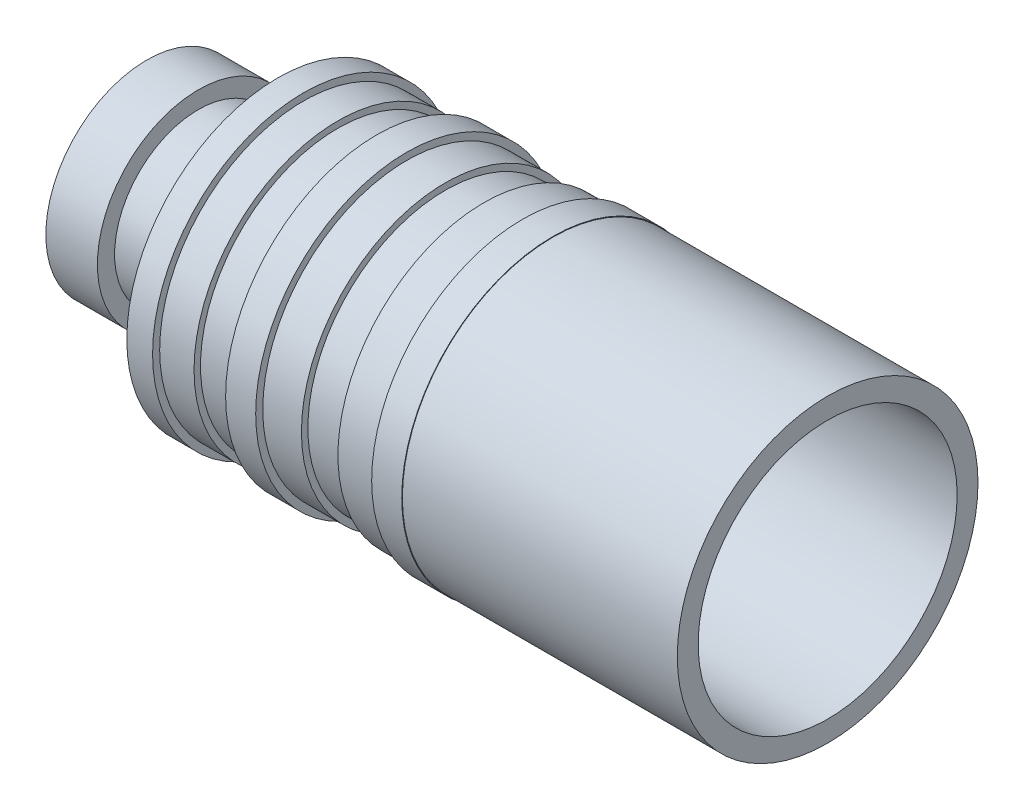
ISO-10303-21;
HEADER;
FILE_DESCRIPTION(('STEP AP214'),'2;1');
FILE_NAME('part.step','',(''),(''),'','','');
FILE_SCHEMA(('AUTOMOTIVE_DESIGN { 1 0 10303 214 1 1 1 1 }'));
ENDSEC;
DATA;
#1=APPLICATION_CONTEXT('core data for automotive mechanical design processes');
#2=APPLICATION_PROTOCOL_DEFINITION('international standard','automotive_design',2000,#1);
#3=PRODUCT_CONTEXT('',#1,'mechanical');
#4=PRODUCT('Part','Part','',(#3));
#5=PRODUCT_RELATED_PRODUCT_CATEGORY('part','',(#4));
#6=PRODUCT_DEFINITION_FORMATION('','',#4);
#7=PRODUCT_DEFINITION_CONTEXT('part definition',#1,'design');
#8=PRODUCT_DEFINITION('design','',#6,#7);
#9=PRODUCT_DEFINITION_SHAPE('','',#8);
#10=(LENGTH_UNIT() NAMED_UNIT(*) SI_UNIT(.MILLI.,.METRE.));
#11=(NAMED_UNIT(*) PLANE_ANGLE_UNIT() SI_UNIT($,.RADIAN.));
#12=(NAMED_UNIT(*) SI_UNIT($,.STERADIAN.) SOLID_ANGLE_UNIT());
#13=UNCERTAINTY_MEASURE_WITH_UNIT(LENGTH_MEASURE(1.E-05),#10,'distance_accuracy_value','');
#14=(GEOMETRIC_REPRESENTATION_CONTEXT(3) GLOBAL_UNCERTAINTY_ASSIGNED_CONTEXT((#13)) GLOBAL_UNIT_ASSIGNED_CONTEXT((#10,
#11,#12)) REPRESENTATION_CONTEXT('',''));
#15=CARTESIAN_POINT('',(0.,0.,0.));
#16=DIRECTION('',(0.,0.,1.));
#17=DIRECTION('',(1.,0.,0.));
#18=AXIS2_PLACEMENT_3D('',#15,#16,#17);
#19=CARTESIAN_POINT('',(5.5,0.,0.));
#20=DIRECTION('',(-1.,0.,0.));
#21=DIRECTION('',(0.,0.,1.));
#22=AXIS2_PLACEMENT_3D('',#19,#20,#21);
#23=CYLINDRICAL_SURFACE('',#22,15.);
#24=CARTESIAN_POINT('',(5.5,0.,0.));
#25=DIRECTION('',(1.,0.,0.));
#26=DIRECTION('',(0.,0.,-1.));
#27=AXIS2_PLACEMENT_3D('',#24,#25,#26);
#28=CIRCLE('',#27,15.);
#29=CARTESIAN_POINT('',(5.5,0.,-15.));
#30=VERTEX_POINT('',#29);
#31=EDGE_CURVE('E126',#30,#30,#28,.T.);
#32=ORIENTED_EDGE('',*,*,#31,.F.);
#33=EDGE_LOOP('',(#32));
#34=FACE_BOUND('',#33,.T.);
#35=CARTESIAN_POINT('',(0.,0.,0.));
#36=DIRECTION('',(1.,0.,0.));
#37=DIRECTION('',(0.,0.,-1.));
#38=AXIS2_PLACEMENT_3D('',#35,#36,#37);
#39=CIRCLE('',#38,15.);
#40=CARTESIAN_POINT('',(0.,0.,-15.));
#41=VERTEX_POINT('',#40);
#42=EDGE_CURVE('E37',#41,#41,#39,.T.);
#43=ORIENTED_EDGE('',*,*,#42,.T.);
#44=EDGE_LOOP('',(#43));
#45=FACE_BOUND('',#44,.T.);
#46=ADVANCED_FACE('F34',(#34,#45),#23,.T.);
#47=CARTESIAN_POINT('',(0.,0.,0.));
#48=DIRECTION('',(1.,0.,0.));
#49=DIRECTION('',(0.,0.,-1.));
#50=AXIS2_PLACEMENT_3D('',#47,#48,#49);
#51=PLANE('',#50);
#52=ORIENTED_EDGE('',*,*,#42,.F.);
#53=EDGE_LOOP('',(#52));
#54=FACE_BOUND('',#53,.T.);
#55=ADVANCED_FACE('F138',(#54),#51,.F.);
#56=CARTESIAN_POINT('',(17.5,0.,0.));
#57=DIRECTION('',(-1.,0.,0.));
#58=DIRECTION('',(0.,0.,1.));
#59=AXIS2_PLACEMENT_3D('',#56,#57,#58);
#60=CYLINDRICAL_SURFACE('',#59,23.5);
#61=CARTESIAN_POINT('',(17.5,0.,0.));
#62=DIRECTION('',(1.,0.,0.));
#63=DIRECTION('',(0.,0.,-1.));
#64=AXIS2_PLACEMENT_3D('',#61,#62,#63);
#65=CIRCLE('',#64,23.5);
#66=CARTESIAN_POINT('',(17.5,0.,-23.5));
#67=VERTEX_POINT('',#66);
#68=EDGE_CURVE('E127',#67,#67,#65,.T.);
#69=ORIENTED_EDGE('',*,*,#68,.F.);
#70=EDGE_LOOP('',(#69));
#71=FACE_BOUND('',#70,.T.);
#72=CARTESIAN_POINT('',(5.5,0.,0.));
#73=DIRECTION('',(1.,0.,0.));
#74=DIRECTION('',(0.,0.,-1.));
#75=AXIS2_PLACEMENT_3D('',#72,#73,#74);
#76=CIRCLE('',#75,23.5);
#77=CARTESIAN_POINT('',(5.5,0.,-23.5));
#78=VERTEX_POINT('',#77);
#79=EDGE_CURVE('E123',#78,#78,#76,.T.);
#80=ORIENTED_EDGE('',*,*,#79,.T.);
#81=EDGE_LOOP('',(#80));
#82=FACE_BOUND('',#81,.T.);
#83=ADVANCED_FACE('F140',(#71,#82),#60,.T.);
#84=CARTESIAN_POINT('',(17.5,0.,0.));
#85=DIRECTION('',(1.,0.,0.));
#86=DIRECTION('',(0.,0.,-1.));
#87=AXIS2_PLACEMENT_3D('',#84,#85,#86);
#88=PLANE('',#87);
#89=CARTESIAN_POINT('',(17.5,0.,0.));
#90=DIRECTION('',(1.,0.,0.));
#91=DIRECTION('',(0.,0.,-1.));
#92=AXIS2_PLACEMENT_3D('',#89,#90,#91);
#93=CIRCLE('',#92,19.5);
#94=CARTESIAN_POINT('',(17.5,0.,-19.5));
#95=VERTEX_POINT('',#94);
#96=EDGE_CURVE('E108',#95,#95,#93,.T.);
#97=ORIENTED_EDGE('',*,*,#96,.F.);
#98=EDGE_LOOP('',(#97));
#99=FACE_BOUND('',#98,.T.);
#100=ORIENTED_EDGE('',*,*,#68,.T.);
#101=EDGE_LOOP('',(#100));
#102=FACE_BOUND('',#101,.T.);
#103=ADVANCED_FACE('F145',(#99,#102),#88,.T.);
#104=CARTESIAN_POINT('',(5.5,0.,0.));
#105=DIRECTION('',(1.,0.,0.));
#106=DIRECTION('',(0.,0.,-1.));
#107=AXIS2_PLACEMENT_3D('',#104,#105,#106);
#108=PLANE('',#107);
#109=ORIENTED_EDGE('',*,*,#31,.T.);
#110=EDGE_LOOP('',(#109));
#111=FACE_BOUND('',#110,.T.);
#112=ORIENTED_EDGE('',*,*,#79,.F.);
#113=EDGE_LOOP('',(#112));
#114=FACE_BOUND('',#113,.T.);
#115=ADVANCED_FACE('F150',(#111,#114),#108,.F.);
#116=CARTESIAN_POINT('',(29.3,0.,0.));
#117=DIRECTION('',(-1.,0.,0.));
#118=DIRECTION('',(0.,0.,1.));
#119=AXIS2_PLACEMENT_3D('',#116,#117,#118);
#120=CYLINDRICAL_SURFACE('',#119,19.5);
#121=CARTESIAN_POINT('',(29.3,0.,0.));
#122=DIRECTION('',(1.,0.,0.));
#123=DIRECTION('',(0.,0.,-1.));
#124=AXIS2_PLACEMENT_3D('',#121,#122,#123);
#125=CIRCLE('',#124,19.5);
#126=CARTESIAN_POINT('',(29.3,0.,-19.5));
#127=VERTEX_POINT('',#126);
#128=EDGE_CURVE('E118',#127,#127,#125,.T.);
#129=ORIENTED_EDGE('',*,*,#128,.F.);
#130=EDGE_LOOP('',(#129));
#131=FACE_BOUND('',#130,.T.);
#132=ORIENTED_EDGE('',*,*,#96,.T.);
#133=EDGE_LOOP('',(#132));
#134=FACE_BOUND('',#133,.T.);
#135=ADVANCED_FACE('F153',(#131,#134),#120,.T.);
#136=CARTESIAN_POINT('',(36.,0.,0.));
#137=DIRECTION('',(-1.,0.,0.));
#138=DIRECTION('',(0.,0.,1.));
#139=AXIS2_PLACEMENT_3D('',#136,#137,#138);
#140=CYLINDRICAL_SURFACE('',#139,20.25);
#141=CARTESIAN_POINT('',(36.,0.,0.));
#142=DIRECTION('',(1.,0.,0.));
#143=DIRECTION('',(0.,0.,-1.));
#144=AXIS2_PLACEMENT_3D('',#141,#142,#143);
#145=CIRCLE('',#144,20.25);
#146=CARTESIAN_POINT('',(36.,0.,-20.25));
#147=VERTEX_POINT('',#146);
#148=EDGE_CURVE('E115',#147,#147,#145,.T.);
#149=ORIENTED_EDGE('',*,*,#148,.F.);
#150=EDGE_LOOP('',(#149));
#151=FACE_BOUND('',#150,.T.);
#152=CARTESIAN_POINT('',(29.3,0.,0.));
#153=DIRECTION('',(1.,0.,0.));
#154=DIRECTION('',(0.,0.,-1.));
#155=AXIS2_PLACEMENT_3D('',#152,#153,#154);
#156=CIRCLE('',#155,20.25);
#157=CARTESIAN_POINT('',(29.3,0.,-20.25));
#158=VERTEX_POINT('',#157);
#159=EDGE_CURVE('E112',#158,#158,#156,.T.);
#160=ORIENTED_EDGE('',*,*,#159,.T.);
#161=EDGE_LOOP('',(#160));
#162=FACE_BOUND('',#161,.T.);
#163=ADVANCED_FACE('F159',(#151,#162),#140,.T.);
#164=CARTESIAN_POINT('',(29.3,0.,0.));
#165=DIRECTION('',(1.,0.,0.));
#166=DIRECTION('',(0.,0.,-1.));
#167=AXIS2_PLACEMENT_3D('',#164,#165,#166);
#168=PLANE('',#167);
#169=ORIENTED_EDGE('',*,*,#128,.T.);
#170=EDGE_LOOP('',(#169));
#171=FACE_BOUND('',#170,.T.);
#172=ORIENTED_EDGE('',*,*,#159,.F.);
#173=EDGE_LOOP('',(#172));
#174=FACE_BOUND('',#173,.T.);
#175=ADVANCED_FACE('F163',(#171,#174),#168,.F.);
#176=CARTESIAN_POINT('',(42.,0.,0.));
#177=DIRECTION('',(-1.,0.,0.));
#178=DIRECTION('',(0.,0.,1.));
#179=AXIS2_PLACEMENT_3D('',#176,#177,#178);
#180=CYLINDRICAL_SURFACE('',#179,35.15);
#181=CARTESIAN_POINT('',(42.,0.,0.));
#182=DIRECTION('',(1.,0.,0.));
#183=DIRECTION('',(0.,0.,-1.));
#184=AXIS2_PLACEMENT_3D('',#181,#182,#183);
#185=CIRCLE('',#184,35.15);
#186=CARTESIAN_POINT('',(42.,0.,-35.15));
#187=VERTEX_POINT('',#186);
#188=EDGE_CURVE('E109',#187,#187,#185,.T.);
#189=ORIENTED_EDGE('',*,*,#188,.F.);
#190=EDGE_LOOP('',(#189));
#191=FACE_BOUND('',#190,.T.);
#192=CARTESIAN_POINT('',(36.,0.,0.));
#193=DIRECTION('',(1.,0.,0.));
#194=DIRECTION('',(0.,0.,-1.));
#195=AXIS2_PLACEMENT_3D('',#192,#193,#194);
#196=CIRCLE('',#195,35.15);
#197=CARTESIAN_POINT('',(36.,0.,-35.15));
#198=VERTEX_POINT('',#197);
#199=EDGE_CURVE('E105',#198,#198,#196,.T.);
#200=ORIENTED_EDGE('',*,*,#199,.T.);
#201=EDGE_LOOP('',(#200));
#202=FACE_BOUND('',#201,.T.);
#203=ADVANCED_FACE('F167',(#191,#202),#180,.T.);
#204=CARTESIAN_POINT('',(42.,0.,0.));
#205=DIRECTION('',(1.,0.,0.));
#206=DIRECTION('',(0.,0.,-1.));
#207=AXIS2_PLACEMENT_3D('',#204,#205,#206);
#208=PLANE('',#207);
#209=CARTESIAN_POINT('',(42.,0.,0.));
#210=DIRECTION('',(1.,0.,0.));
#211=DIRECTION('',(0.,0.,-1.));
#212=AXIS2_PLACEMENT_3D('',#209,#210,#211);
#213=CIRCLE('',#212,33.5);
#214=CARTESIAN_POINT('',(42.,0.,-33.5));
#215=VERTEX_POINT('',#214);
#216=EDGE_CURVE('E102',#215,#215,#213,.T.);
#217=ORIENTED_EDGE('',*,*,#216,.F.);
#218=EDGE_LOOP('',(#217));
#219=FACE_BOUND('',#218,.T.);
#220=ORIENTED_EDGE('',*,*,#188,.T.);
#221=EDGE_LOOP('',(#220));
#222=FACE_BOUND('',#221,.T.);
#223=ADVANCED_FACE('F171',(#219,#222),#208,.T.);
#224=CARTESIAN_POINT('',(36.,0.,0.));
#225=DIRECTION('',(1.,0.,0.));
#226=DIRECTION('',(0.,0.,-1.));
#227=AXIS2_PLACEMENT_3D('',#224,#225,#226);
#228=PLANE('',#227);
#229=ORIENTED_EDGE('',*,*,#148,.T.);
#230=EDGE_LOOP('',(#229));
#231=FACE_BOUND('',#230,.T.);
#232=ORIENTED_EDGE('',*,*,#199,.F.);
#233=EDGE_LOOP('',(#232));
#234=FACE_BOUND('',#233,.T.);
#235=ADVANCED_FACE('F173',(#231,#234),#228,.F.);
#236=CARTESIAN_POINT('',(50.,0.,0.));
#237=DIRECTION('',(-1.,0.,0.));
#238=DIRECTION('',(0.,0.,1.));
#239=AXIS2_PLACEMENT_3D('',#236,#237,#238);
#240=CYLINDRICAL_SURFACE('',#239,33.5);
#241=CARTESIAN_POINT('',(50.,0.,0.));
#242=DIRECTION('',(1.,0.,0.));
#243=DIRECTION('',(0.,0.,-1.));
#244=AXIS2_PLACEMENT_3D('',#241,#242,#243);
#245=CIRCLE('',#244,33.5);
#246=CARTESIAN_POINT('',(50.,0.,-33.5));
#247=VERTEX_POINT('',#246);
#248=EDGE_CURVE('E99',#247,#247,#245,.T.);
#249=ORIENTED_EDGE('',*,*,#248,.F.);
#250=EDGE_LOOP('',(#249));
#251=FACE_BOUND('',#250,.T.);
#252=ORIENTED_EDGE('',*,*,#216,.T.);
#253=EDGE_LOOP('',(#252));
#254=FACE_BOUND('',#253,.T.);
#255=ADVANCED_FACE('F176',(#251,#254),#240,.T.);
#256=CARTESIAN_POINT('',(50.,0.,0.));
#257=DIRECTION('',(1.,0.,0.));
#258=DIRECTION('',(0.,0.,-1.));
#259=AXIS2_PLACEMENT_3D('',#256,#257,#258);
#260=PLANE('',#259);
#261=CARTESIAN_POINT('',(50.,0.,0.));
#262=DIRECTION('',(1.,0.,0.));
#263=DIRECTION('',(0.,0.,-1.));
#264=AXIS2_PLACEMENT_3D('',#261,#262,#263);
#265=CIRCLE('',#264,32.);
#266=CARTESIAN_POINT('',(50.,0.,-32.));
#267=VERTEX_POINT('',#266);
#268=EDGE_CURVE('E90',#267,#267,#265,.T.);
#269=ORIENTED_EDGE('',*,*,#268,.F.);
#270=EDGE_LOOP('',(#269));
#271=FACE_BOUND('',#270,.T.);
#272=ORIENTED_EDGE('',*,*,#248,.T.);
#273=EDGE_LOOP('',(#272));
#274=FACE_BOUND('',#273,.T.);
#275=ADVANCED_FACE('F183',(#271,#274),#260,.T.);
#276=CARTESIAN_POINT('',(59.,0.,0.));
#277=DIRECTION('',(-1.,0.,0.));
#278=DIRECTION('',(0.,0.,1.));
#279=AXIS2_PLACEMENT_3D('',#276,#277,#278);
#280=CYLINDRICAL_SURFACE('',#279,32.);
#281=CARTESIAN_POINT('',(59.,0.,0.));
#282=DIRECTION('',(1.,0.,0.));
#283=DIRECTION('',(0.,0.,-1.));
#284=AXIS2_PLACEMENT_3D('',#281,#282,#283);
#285=CIRCLE('',#284,32.);
#286=CARTESIAN_POINT('',(59.,0.,-32.));
#287=VERTEX_POINT('',#286);
#288=EDGE_CURVE('E94',#287,#287,#285,.T.);
#289=ORIENTED_EDGE('',*,*,#288,.F.);
#290=EDGE_LOOP('',(#289));
#291=FACE_BOUND('',#290,.T.);
#292=ORIENTED_EDGE('',*,*,#268,.T.);
#293=EDGE_LOOP('',(#292));
#294=FACE_BOUND('',#293,.T.);
#295=ADVANCED_FACE('F187',(#291,#294),#280,.T.);
#296=CARTESIAN_POINT('',(66.,0.,0.));
#297=DIRECTION('',(-1.,0.,0.));
#298=DIRECTION('',(0.,0.,1.));
#299=AXIS2_PLACEMENT_3D('',#296,#297,#298);
#300=CYLINDRICAL_SURFACE('',#299,35.15);
#301=CARTESIAN_POINT('',(66.,0.,0.));
#302=DIRECTION('',(1.,0.,0.));
#303=DIRECTION('',(0.,0.,-1.));
#304=AXIS2_PLACEMENT_3D('',#301,#302,#303);
#305=CIRCLE('',#304,35.15);
#306=CARTESIAN_POINT('',(66.,0.,-35.15));
#307=VERTEX_POINT('',#306);
#308=EDGE_CURVE('E91',#307,#307,#305,.T.);
#309=ORIENTED_EDGE('',*,*,#308,.F.);
#310=EDGE_LOOP('',(#309));
#311=FACE_BOUND('',#310,.T.);
#312=CARTESIAN_POINT('',(59.,0.,0.));
#313=DIRECTION('',(1.,0.,0.));
#314=DIRECTION('',(0.,0.,-1.));
#315=AXIS2_PLACEMENT_3D('',#312,#313,#314);
#316=CIRCLE('',#315,35.15);
#317=CARTESIAN_POINT('',(59.,0.,-35.15));
#318=VERTEX_POINT('',#317);
#319=EDGE_CURVE('E87',#318,#318,#316,.T.);
#320=ORIENTED_EDGE('',*,*,#319,.T.);
#321=EDGE_LOOP('',(#320));
#322=FACE_BOUND('',#321,.T.);
#323=ADVANCED_FACE('F191',(#311,#322),#300,.T.);
#324=CARTESIAN_POINT('',(66.,0.,0.));
#325=DIRECTION('',(1.,0.,0.));
#326=DIRECTION('',(0.,0.,-1.));
#327=AXIS2_PLACEMENT_3D('',#324,#325,#326);
#328=PLANE('',#327);
#329=CARTESIAN_POINT('',(66.,0.,0.));
#330=DIRECTION('',(1.,0.,0.));
#331=DIRECTION('',(0.,0.,-1.));
#332=AXIS2_PLACEMENT_3D('',#329,#330,#331);
#333=CIRCLE('',#332,33.5);
#334=CARTESIAN_POINT('',(66.,0.,-33.5));
#335=VERTEX_POINT('',#334);
#336=EDGE_CURVE('E84',#335,#335,#333,.T.);
#337=ORIENTED_EDGE('',*,*,#336,.F.);
#338=EDGE_LOOP('',(#337));
#339=FACE_BOUND('',#338,.T.);
#340=ORIENTED_EDGE('',*,*,#308,.T.);
#341=EDGE_LOOP('',(#340));
#342=FACE_BOUND('',#341,.T.);
#343=ADVANCED_FACE('F195',(#339,#342),#328,.T.);
#344=CARTESIAN_POINT('',(59.,0.,0.));
#345=DIRECTION('',(1.,0.,0.));
#346=DIRECTION('',(0.,0.,-1.));
#347=AXIS2_PLACEMENT_3D('',#344,#345,#346);
#348=PLANE('',#347);
#349=ORIENTED_EDGE('',*,*,#288,.T.);
#350=EDGE_LOOP('',(#349));
#351=FACE_BOUND('',#350,.T.);
#352=ORIENTED_EDGE('',*,*,#319,.F.);
#353=EDGE_LOOP('',(#352));
#354=FACE_BOUND('',#353,.T.);
#355=ADVANCED_FACE('F197',(#351,#354),#348,.F.);
#356=CARTESIAN_POINT('',(75.,0.,0.));
#357=DIRECTION('',(-1.,0.,0.));
#358=DIRECTION('',(0.,0.,1.));
#359=AXIS2_PLACEMENT_3D('',#356,#357,#358);
#360=CYLINDRICAL_SURFACE('',#359,33.5);
#361=CARTESIAN_POINT('',(75.,0.,0.));
#362=DIRECTION('',(1.,0.,0.));
#363=DIRECTION('',(0.,0.,-1.));
#364=AXIS2_PLACEMENT_3D('',#361,#362,#363);
#365=CIRCLE('',#364,33.5);
#366=CARTESIAN_POINT('',(75.,0.,-33.5));
#367=VERTEX_POINT('',#366);
#368=EDGE_CURVE('E81',#367,#367,#365,.T.);
#369=ORIENTED_EDGE('',*,*,#368,.F.);
#370=EDGE_LOOP('',(#369));
#371=FACE_BOUND('',#370,.T.);
#372=ORIENTED_EDGE('',*,*,#336,.T.);
#373=EDGE_LOOP('',(#372));
#374=FACE_BOUND('',#373,.T.);
#375=ADVANCED_FACE('F200',(#371,#374),#360,.T.);
#376=CARTESIAN_POINT('',(75.,0.,0.));
#377=DIRECTION('',(1.,0.,0.));
#378=DIRECTION('',(0.,0.,-1.));
#379=AXIS2_PLACEMENT_3D('',#376,#377,#378);
#380=PLANE('',#379);
#381=CARTESIAN_POINT('',(75.,0.,0.));
#382=DIRECTION('',(1.,0.,0.));
#383=DIRECTION('',(0.,0.,-1.));
#384=AXIS2_PLACEMENT_3D('',#381,#382,#383);
#385=CIRCLE('',#384,32.);
#386=CARTESIAN_POINT('',(75.,0.,-32.));
#387=VERTEX_POINT('',#386);
#388=EDGE_CURVE('E41',#387,#387,#385,.T.);
#389=ORIENTED_EDGE('',*,*,#388,.F.);
#390=EDGE_LOOP('',(#389));
#391=FACE_BOUND('',#390,.T.);
#392=ORIENTED_EDGE('',*,*,#368,.T.);
#393=EDGE_LOOP('',(#392));
#394=FACE_BOUND('',#393,.T.);
#395=ADVANCED_FACE('F207',(#391,#394),#380,.T.);
#396=CARTESIAN_POINT('',(84.,0.,0.));
#397=DIRECTION('',(-1.,0.,0.));
#398=DIRECTION('',(0.,0.,1.));
#399=AXIS2_PLACEMENT_3D('',#396,#397,#398);
#400=CYLINDRICAL_SURFACE('',#399,32.);
#401=CARTESIAN_POINT('',(84.,0.,0.));
#402=DIRECTION('',(1.,0.,0.));
#403=DIRECTION('',(0.,0.,-1.));
#404=AXIS2_PLACEMENT_3D('',#401,#402,#403);
#405=CIRCLE('',#404,32.);
#406=CARTESIAN_POINT('',(84.,0.,-32.));
#407=VERTEX_POINT('',#406);
#408=EDGE_CURVE('E76',#407,#407,#405,.T.);
#409=ORIENTED_EDGE('',*,*,#408,.F.);
#410=EDGE_LOOP('',(#409));
#411=FACE_BOUND('',#410,.T.);
#412=ORIENTED_EDGE('',*,*,#388,.T.);
#413=EDGE_LOOP('',(#412));
#414=FACE_BOUND('',#413,.T.);
#415=ADVANCED_FACE('F211',(#411,#414),#400,.T.);
#416=CARTESIAN_POINT('',(93.,0.,0.));
#417=DIRECTION('',(-1.,0.,0.));
#418=DIRECTION('',(0.,0.,1.));
#419=AXIS2_PLACEMENT_3D('',#416,#417,#418);
#420=CYLINDRICAL_SURFACE('',#419,34.);
#421=CARTESIAN_POINT('',(93.,0.,0.));
#422=DIRECTION('',(1.,0.,0.));
#423=DIRECTION('',(0.,0.,-1.));
#424=AXIS2_PLACEMENT_3D('',#421,#422,#423);
#425=CIRCLE('',#424,34.);
#426=CARTESIAN_POINT('',(93.,0.,-34.));
#427=VERTEX_POINT('',#426);
#428=EDGE_CURVE('E73',#427,#427,#425,.T.);
#429=ORIENTED_EDGE('',*,*,#428,.F.);
#430=EDGE_LOOP('',(#429));
#431=FACE_BOUND('',#430,.T.);
#432=CARTESIAN_POINT('',(84.,0.,0.));
#433=DIRECTION('',(1.,0.,0.));
#434=DIRECTION('',(0.,0.,-1.));
#435=AXIS2_PLACEMENT_3D('',#432,#433,#434);
#436=CIRCLE('',#435,34.);
#437=CARTESIAN_POINT('',(84.,0.,-34.));
#438=VERTEX_POINT('',#437);
#439=EDGE_CURVE('E70',#438,#438,#436,.T.);
#440=ORIENTED_EDGE('',*,*,#439,.T.);
#441=EDGE_LOOP('',(#440));
#442=FACE_BOUND('',#441,.T.);
#443=ADVANCED_FACE('F215',(#431,#442),#420,.T.);
#444=CARTESIAN_POINT('',(84.,0.,0.));
#445=DIRECTION('',(1.,0.,0.));
#446=DIRECTION('',(0.,0.,-1.));
#447=AXIS2_PLACEMENT_3D('',#444,#445,#446);
#448=PLANE('',#447);
#449=ORIENTED_EDGE('',*,*,#408,.T.);
#450=EDGE_LOOP('',(#449));
#451=FACE_BOUND('',#450,.T.);
#452=ORIENTED_EDGE('',*,*,#439,.F.);
#453=EDGE_LOOP('',(#452));
#454=FACE_BOUND('',#453,.T.);
#455=ADVANCED_FACE('F219',(#451,#454),#448,.F.);
#456=CARTESIAN_POINT('',(100.,0.,0.));
#457=DIRECTION('',(-1.,0.,0.));
#458=DIRECTION('',(0.,0.,1.));
#459=AXIS2_PLACEMENT_3D('',#456,#457,#458);
#460=CYLINDRICAL_SURFACE('',#459,35.15);
#461=CARTESIAN_POINT('',(100.,0.,0.));
#462=DIRECTION('',(1.,0.,0.));
#463=DIRECTION('',(0.,0.,-1.));
#464=AXIS2_PLACEMENT_3D('',#461,#462,#463);
#465=CIRCLE('',#464,35.15);
#466=CARTESIAN_POINT('',(100.,0.,-35.15));
#467=VERTEX_POINT('',#466);
#468=EDGE_CURVE('E67',#467,#467,#465,.T.);
#469=ORIENTED_EDGE('',*,*,#468,.F.);
#470=EDGE_LOOP('',(#469));
#471=FACE_BOUND('',#470,.T.);
#472=CARTESIAN_POINT('',(93.,0.,0.));
#473=DIRECTION('',(1.,0.,0.));
#474=DIRECTION('',(0.,0.,-1.));
#475=AXIS2_PLACEMENT_3D('',#472,#473,#474);
#476=CIRCLE('',#475,35.15);
#477=CARTESIAN_POINT('',(93.,0.,-35.15));
#478=VERTEX_POINT('',#477);
#479=EDGE_CURVE('E65',#478,#478,#476,.T.);
#480=ORIENTED_EDGE('',*,*,#479,.T.);
#481=EDGE_LOOP('',(#480));
#482=FACE_BOUND('',#481,.T.);
#483=ADVANCED_FACE('F223',(#471,#482),#460,.T.);
#484=CARTESIAN_POINT('',(100.,0.,0.));
#485=DIRECTION('',(1.,0.,0.));
#486=DIRECTION('',(0.,0.,-1.));
#487=AXIS2_PLACEMENT_3D('',#484,#485,#486);
#488=PLANE('',#487);
#489=CARTESIAN_POINT('',(100.,0.,0.));
#490=DIRECTION('',(1.,0.,0.));
#491=DIRECTION('',(0.,0.,-1.));
#492=AXIS2_PLACEMENT_3D('',#489,#490,#491);
#493=CIRCLE('',#492,35.);
#494=CARTESIAN_POINT('',(100.,0.,-35.));
#495=VERTEX_POINT('',#494);
#496=EDGE_CURVE('E11',#495,#495,#493,.T.);
#497=ORIENTED_EDGE('',*,*,#496,.F.);
#498=EDGE_LOOP('',(#497));
#499=FACE_BOUND('',#498,.T.);
#500=ORIENTED_EDGE('',*,*,#468,.T.);
#501=EDGE_LOOP('',(#500));
#502=FACE_BOUND('',#501,.T.);
#503=ADVANCED_FACE('F227',(#499,#502),#488,.T.);
#504=CARTESIAN_POINT('',(93.,0.,0.));
#505=DIRECTION('',(1.,0.,0.));
#506=DIRECTION('',(0.,0.,-1.));
#507=AXIS2_PLACEMENT_3D('',#504,#505,#506);
#508=PLANE('',#507);
#509=ORIENTED_EDGE('',*,*,#428,.T.);
#510=EDGE_LOOP('',(#509));
#511=FACE_BOUND('',#510,.T.);
#512=ORIENTED_EDGE('',*,*,#479,.F.);
#513=EDGE_LOOP('',(#512));
#514=FACE_BOUND('',#513,.T.);
#515=ADVANCED_FACE('F229',(#511,#514),#508,.F.);
#516=CARTESIAN_POINT('',(164.,0.,0.));
#517=DIRECTION('',(-1.,0.,0.));
#518=DIRECTION('',(0.,0.,1.));
#519=AXIS2_PLACEMENT_3D('',#516,#517,#518);
#520=CYLINDRICAL_SURFACE('',#519,35.);
#521=CARTESIAN_POINT('',(164.,0.,0.));
#522=DIRECTION('',(1.,0.,0.));
#523=DIRECTION('',(0.,0.,-1.));
#524=AXIS2_PLACEMENT_3D('',#521,#522,#523);
#525=CIRCLE('',#524,35.);
#526=CARTESIAN_POINT('',(164.,0.,-35.));
#527=VERTEX_POINT('',#526);
#528=EDGE_CURVE('E57',#527,#527,#525,.T.);
#529=ORIENTED_EDGE('',*,*,#528,.F.);
#530=EDGE_LOOP('',(#529));
#531=FACE_BOUND('',#530,.T.);
#532=ORIENTED_EDGE('',*,*,#496,.T.);
#533=EDGE_LOOP('',(#532));
#534=FACE_BOUND('',#533,.T.);
#535=ADVANCED_FACE('F232',(#531,#534),#520,.T.);
#536=CARTESIAN_POINT('',(164.,0.,0.));
#537=DIRECTION('',(1.,0.,0.));
#538=DIRECTION('',(0.,0.,-1.));
#539=AXIS2_PLACEMENT_3D('',#536,#537,#538);
#540=PLANE('',#539);
#541=CARTESIAN_POINT('',(164.,0.,0.));
#542=DIRECTION('',(1.,0.,0.));
#543=DIRECTION('',(0.,0.,-1.));
#544=AXIS2_PLACEMENT_3D('',#541,#542,#543);
#545=CIRCLE('',#544,30.1457784518832);
#546=CARTESIAN_POINT('',(164.,0.,-30.1457784518832));
#547=VERTEX_POINT('',#546);
#548=EDGE_CURVE('E54',#547,#547,#545,.T.);
#549=ORIENTED_EDGE('',*,*,#548,.F.);
#550=EDGE_LOOP('',(#549));
#551=FACE_BOUND('',#550,.T.);
#552=ORIENTED_EDGE('',*,*,#528,.T.);
#553=EDGE_LOOP('',(#552));
#554=FACE_BOUND('',#553,.T.);
#555=ADVANCED_FACE('F239',(#551,#554),#540,.T.);
#556=CARTESIAN_POINT('',(164.,0.,0.));
#557=DIRECTION('',(1.,0.,0.));
#558=DIRECTION('',(0.,0.,-1.));
#559=AXIS2_PLACEMENT_3D('',#556,#557,#558);
#560=CYLINDRICAL_SURFACE('',#559,30.1457784518832);
#561=CARTESIAN_POINT('',(104.875699315354,0.,0.));
#562=DIRECTION('',(1.,0.,0.));
#563=DIRECTION('',(0.,0.,-1.));
#564=AXIS2_PLACEMENT_3D('',#561,#562,#563);
#565=CIRCLE('',#564,30.1457784518832);
#566=CARTESIAN_POINT('',(104.875699315354,0.,-30.1457784518832));
#567=VERTEX_POINT('',#566);
#568=EDGE_CURVE('E52',#567,#567,#565,.T.);
#569=ORIENTED_EDGE('',*,*,#568,.F.);
#570=EDGE_LOOP('',(#569));
#571=FACE_BOUND('',#570,.T.);
#572=ORIENTED_EDGE('',*,*,#548,.T.);
#573=EDGE_LOOP('',(#572));
#574=FACE_BOUND('',#573,.T.);
#575=ADVANCED_FACE('F48',(#571,#574),#560,.F.);
#576=CARTESIAN_POINT('',(104.875699315354,0.,-30.1457784518832));
#577=CARTESIAN_POINT('',(111.575177394707,0.,-21.3237724646868));
#578=CARTESIAN_POINT('',(113.598201805079,0.,-11.1159112876113));
#579=CARTESIAN_POINT('',(113.598201805079,0.,0.));
#580=B_SPLINE_CURVE_WITH_KNOTS('',3,(#576,#577,#578,#579),.UNSPECIFIED.,.F.,.F.,(4,4),(0.,1.),.UNSPECIFIED.);
#581=CARTESIAN_POINT('',(164.,0.,0.));
#582=DIRECTION('',(1.,0.,0.));
#583=AXIS1_PLACEMENT('',#581,#582);
#584=SURFACE_OF_REVOLUTION('',#580,#583);
#585=CARTESIAN_POINT('',(113.598201805079,0.,0.));
#586=VERTEX_POINT('',#585);
#587=VERTEX_LOOP('',#586);
#588=FACE_BOUND('',#587,.T.);
#589=ORIENTED_EDGE('',*,*,#568,.T.);
#590=EDGE_LOOP('',(#589));
#591=FACE_BOUND('',#590,.T.);
#592=ADVANCED_FACE('F45',(#588,#591),#584,.T.);
#593=CLOSED_SHELL('',(#46,#55,#83,#103,#115,#135,#163,#175,#203,#223,#235,#255,#275,#295,#323,
#343,#355,#375,#395,#415,#443,#455,#483,#503,#515,#535,#555,#575,#592));
#594=MANIFOLD_SOLID_BREP('B2',#593);
#595=ADVANCED_BREP_SHAPE_REPRESENTATION('',(#18,#594),#14);
#596=SHAPE_DEFINITION_REPRESENTATION(#9,#595);
ENDSEC;
END-ISO-10303-21;
